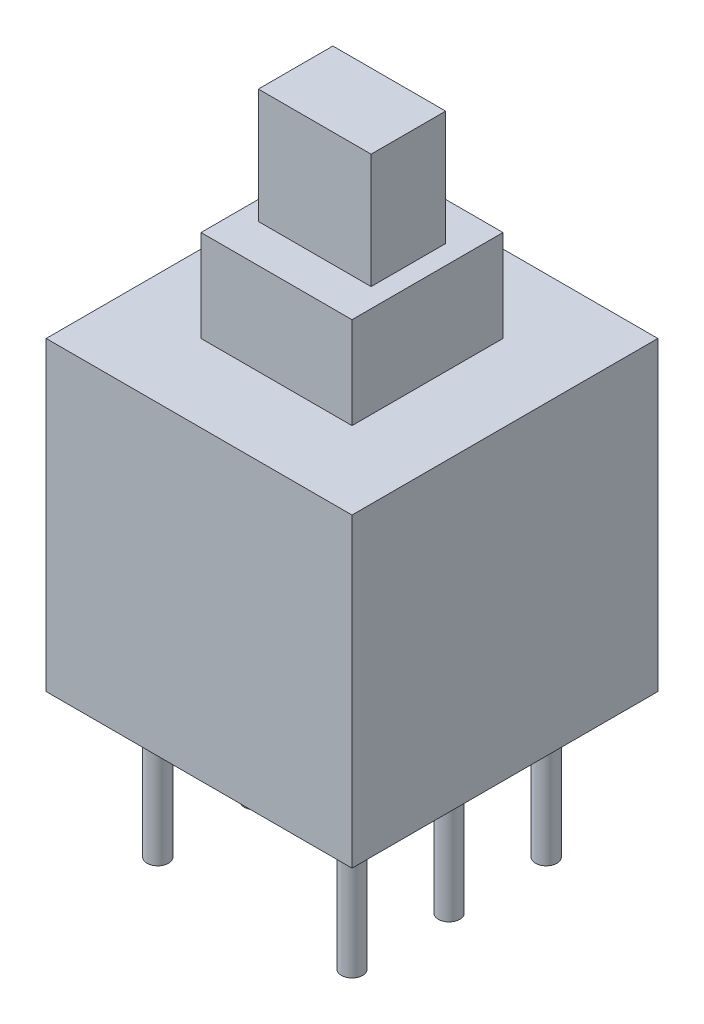
ISO-10303-21;
HEADER;
FILE_DESCRIPTION(('STEP AP214'),'2;1');
FILE_NAME('part.step','',(''),(''),'','','');
FILE_SCHEMA(('AUTOMOTIVE_DESIGN { 1 0 10303 214 1 1 1 1 }'));
ENDSEC;
DATA;
#1=APPLICATION_CONTEXT('core data for automotive mechanical design processes');
#2=APPLICATION_PROTOCOL_DEFINITION('international standard','automotive_design',2000,#1);
#3=PRODUCT_CONTEXT('',#1,'mechanical');
#4=PRODUCT('Part','Part','',(#3));
#5=PRODUCT_RELATED_PRODUCT_CATEGORY('part','',(#4));
#6=PRODUCT_DEFINITION_FORMATION('','',#4);
#7=PRODUCT_DEFINITION_CONTEXT('part definition',#1,'design');
#8=PRODUCT_DEFINITION('design','',#6,#7);
#9=PRODUCT_DEFINITION_SHAPE('','',#8);
#10=(LENGTH_UNIT() NAMED_UNIT(*) SI_UNIT(.MILLI.,.METRE.));
#11=(NAMED_UNIT(*) PLANE_ANGLE_UNIT() SI_UNIT($,.RADIAN.));
#12=(NAMED_UNIT(*) SI_UNIT($,.STERADIAN.) SOLID_ANGLE_UNIT());
#13=UNCERTAINTY_MEASURE_WITH_UNIT(LENGTH_MEASURE(1.E-05),#10,'distance_accuracy_value','');
#14=(GEOMETRIC_REPRESENTATION_CONTEXT(3) GLOBAL_UNCERTAINTY_ASSIGNED_CONTEXT((#13)) GLOBAL_UNIT_ASSIGNED_CONTEXT((#10,
#11,#12)) REPRESENTATION_CONTEXT('',''));
#15=CARTESIAN_POINT('',(0.,0.,0.));
#16=DIRECTION('',(0.,0.,1.));
#17=DIRECTION('',(1.,0.,0.));
#18=AXIS2_PLACEMENT_3D('',#15,#16,#17);
#19=CARTESIAN_POINT('',(-4.,8.,4.));
#20=DIRECTION('',(-1.,0.,0.));
#21=DIRECTION('',(0.,0.,1.));
#22=AXIS2_PLACEMENT_3D('',#19,#20,#21);
#23=PLANE('',#22);
#24=DIRECTION('',(0.,0.,-1.));
#25=VECTOR('',#24,1.);
#26=CARTESIAN_POINT('',(-4.,0.,4.));
#27=LINE('',#26,#25);
#28=CARTESIAN_POINT('',(-4.,0.,4.));
#29=VERTEX_POINT('',#28);
#30=CARTESIAN_POINT('',(-4.,0.,-4.));
#31=VERTEX_POINT('',#30);
#32=EDGE_CURVE('E187',#29,#31,#27,.T.);
#33=ORIENTED_EDGE('',*,*,#32,.F.);
#34=DIRECTION('',(0.,-1.,0.));
#35=VECTOR('',#34,1.);
#36=CARTESIAN_POINT('',(-4.,8.,4.));
#37=LINE('',#36,#35);
#38=CARTESIAN_POINT('',(-4.,8.,4.));
#39=VERTEX_POINT('',#38);
#40=EDGE_CURVE('E11',#39,#29,#37,.T.);
#41=ORIENTED_EDGE('',*,*,#40,.F.);
#42=DIRECTION('',(0.,0.,-1.));
#43=VECTOR('',#42,1.);
#44=CARTESIAN_POINT('',(-4.,8.,4.));
#45=LINE('',#44,#43);
#46=CARTESIAN_POINT('',(-4.,8.,-4.));
#47=VERTEX_POINT('',#46);
#48=EDGE_CURVE('E196',#39,#47,#45,.T.);
#49=ORIENTED_EDGE('',*,*,#48,.T.);
#50=DIRECTION('',(0.,-1.,0.));
#51=VECTOR('',#50,1.);
#52=CARTESIAN_POINT('',(-4.,8.,-4.));
#53=LINE('',#52,#51);
#54=EDGE_CURVE('E37',#47,#31,#53,.T.);
#55=ORIENTED_EDGE('',*,*,#54,.T.);
#56=EDGE_LOOP('',(#33,#41,#49,#55));
#57=FACE_BOUND('',#56,.T.);
#58=ADVANCED_FACE('F34',(#57),#23,.T.);
#59=CARTESIAN_POINT('',(-4.,8.,4.));
#60=DIRECTION('',(0.,0.,-1.));
#61=DIRECTION('',(-1.,0.,0.));
#62=AXIS2_PLACEMENT_3D('',#59,#60,#61);
#63=PLANE('',#62);
#64=DIRECTION('',(1.,0.,0.));
#65=VECTOR('',#64,1.);
#66=CARTESIAN_POINT('',(-4.,0.,4.));
#67=LINE('',#66,#65);
#68=CARTESIAN_POINT('',(4.,0.,4.));
#69=VERTEX_POINT('',#68);
#70=EDGE_CURVE('E200',#29,#69,#67,.T.);
#71=ORIENTED_EDGE('',*,*,#70,.T.);
#72=DIRECTION('',(0.,-1.,0.));
#73=VECTOR('',#72,1.);
#74=CARTESIAN_POINT('',(4.,8.,4.));
#75=LINE('',#74,#73);
#76=CARTESIAN_POINT('',(4.,8.,4.));
#77=VERTEX_POINT('',#76);
#78=EDGE_CURVE('E42',#77,#69,#75,.T.);
#79=ORIENTED_EDGE('',*,*,#78,.F.);
#80=DIRECTION('',(1.,0.,0.));
#81=VECTOR('',#80,1.);
#82=CARTESIAN_POINT('',(-4.,8.,4.));
#83=LINE('',#82,#81);
#84=EDGE_CURVE('E205',#39,#77,#83,.T.);
#85=ORIENTED_EDGE('',*,*,#84,.F.);
#86=ORIENTED_EDGE('',*,*,#40,.T.);
#87=EDGE_LOOP('',(#71,#79,#85,#86));
#88=FACE_BOUND('',#87,.T.);
#89=ADVANCED_FACE('F232',(#88),#63,.F.);
#90=CARTESIAN_POINT('',(4.,8.,4.));
#91=DIRECTION('',(-1.,0.,0.));
#92=DIRECTION('',(0.,0.,1.));
#93=AXIS2_PLACEMENT_3D('',#90,#91,#92);
#94=PLANE('',#93);
#95=DIRECTION('',(0.,0.,-1.));
#96=VECTOR('',#95,1.);
#97=CARTESIAN_POINT('',(4.,0.,4.));
#98=LINE('',#97,#96);
#99=CARTESIAN_POINT('',(4.,0.,-4.));
#100=VERTEX_POINT('',#99);
#101=EDGE_CURVE('E212',#69,#100,#98,.T.);
#102=ORIENTED_EDGE('',*,*,#101,.T.);
#103=DIRECTION('',(0.,-1.,0.));
#104=VECTOR('',#103,1.);
#105=CARTESIAN_POINT('',(4.,8.,-4.));
#106=LINE('',#105,#104);
#107=CARTESIAN_POINT('',(4.,8.,-4.));
#108=VERTEX_POINT('',#107);
#109=EDGE_CURVE('E217',#108,#100,#106,.T.);
#110=ORIENTED_EDGE('',*,*,#109,.F.);
#111=DIRECTION('',(0.,0.,-1.));
#112=VECTOR('',#111,1.);
#113=CARTESIAN_POINT('',(4.,8.,4.));
#114=LINE('',#113,#112);
#115=EDGE_CURVE('E203',#77,#108,#114,.T.);
#116=ORIENTED_EDGE('',*,*,#115,.F.);
#117=ORIENTED_EDGE('',*,*,#78,.T.);
#118=EDGE_LOOP('',(#102,#110,#116,#117));
#119=FACE_BOUND('',#118,.T.);
#120=ADVANCED_FACE('F236',(#119),#94,.F.);
#121=CARTESIAN_POINT('',(-4.,8.,-4.));
#122=DIRECTION('',(0.,0.,-1.));
#123=DIRECTION('',(-1.,0.,0.));
#124=AXIS2_PLACEMENT_3D('',#121,#122,#123);
#125=PLANE('',#124);
#126=DIRECTION('',(1.,0.,0.));
#127=VECTOR('',#126,1.);
#128=CARTESIAN_POINT('',(-4.,0.,-4.));
#129=LINE('',#128,#127);
#130=EDGE_CURVE('E209',#31,#100,#129,.T.);
#131=ORIENTED_EDGE('',*,*,#130,.F.);
#132=ORIENTED_EDGE('',*,*,#54,.F.);
#133=DIRECTION('',(1.,0.,0.));
#134=VECTOR('',#133,1.);
#135=CARTESIAN_POINT('',(-4.,8.,-4.));
#136=LINE('',#135,#134);
#137=EDGE_CURVE('E199',#47,#108,#136,.T.);
#138=ORIENTED_EDGE('',*,*,#137,.T.);
#139=ORIENTED_EDGE('',*,*,#109,.T.);
#140=EDGE_LOOP('',(#131,#132,#138,#139));
#141=FACE_BOUND('',#140,.T.);
#142=ADVANCED_FACE('F225',(#141),#125,.T.);
#143=CARTESIAN_POINT('',(0.,8.,0.));
#144=DIRECTION('',(0.,-1.,0.));
#145=DIRECTION('',(0.,0.,-1.));
#146=AXIS2_PLACEMENT_3D('',#143,#144,#145);
#147=PLANE('',#146);
#148=DIRECTION('',(1.,0.,0.));
#149=VECTOR('',#148,1.);
#150=CARTESIAN_POINT('',(-1.975,8.,1.975));
#151=LINE('',#150,#149);
#152=CARTESIAN_POINT('',(-1.975,8.,1.975));
#153=VERTEX_POINT('',#152);
#154=CARTESIAN_POINT('',(1.975,8.,1.975));
#155=VERTEX_POINT('',#154);
#156=EDGE_CURVE('E168',#153,#155,#151,.T.);
#157=ORIENTED_EDGE('',*,*,#156,.F.);
#158=DIRECTION('',(0.,0.,-1.));
#159=VECTOR('',#158,1.);
#160=CARTESIAN_POINT('',(-1.975,8.,1.975));
#161=LINE('',#160,#159);
#162=CARTESIAN_POINT('',(-1.975,8.,-1.975));
#163=VERTEX_POINT('',#162);
#164=EDGE_CURVE('E159',#153,#163,#161,.T.);
#165=ORIENTED_EDGE('',*,*,#164,.T.);
#166=DIRECTION('',(1.,0.,0.));
#167=VECTOR('',#166,1.);
#168=CARTESIAN_POINT('',(-1.975,8.,-1.975));
#169=LINE('',#168,#167);
#170=CARTESIAN_POINT('',(1.975,8.,-1.975));
#171=VERTEX_POINT('',#170);
#172=EDGE_CURVE('E177',#163,#171,#169,.T.);
#173=ORIENTED_EDGE('',*,*,#172,.T.);
#174=DIRECTION('',(0.,0.,-1.));
#175=VECTOR('',#174,1.);
#176=CARTESIAN_POINT('',(1.975,8.,1.975));
#177=LINE('',#176,#175);
#178=EDGE_CURVE('E179',#155,#171,#177,.T.);
#179=ORIENTED_EDGE('',*,*,#178,.F.);
#180=EDGE_LOOP('',(#157,#165,#173,#179));
#181=FACE_BOUND('',#180,.T.);
#182=ORIENTED_EDGE('',*,*,#48,.F.);
#183=ORIENTED_EDGE('',*,*,#84,.T.);
#184=ORIENTED_EDGE('',*,*,#115,.T.);
#185=ORIENTED_EDGE('',*,*,#137,.F.);
#186=EDGE_LOOP('',(#182,#183,#184,#185));
#187=FACE_BOUND('',#186,.T.);
#188=ADVANCED_FACE('F238',(#181,#187),#147,.F.);
#189=CARTESIAN_POINT('',(0.,0.,0.));
#190=DIRECTION('',(0.,-1.,0.));
#191=DIRECTION('',(0.,0.,-1.));
#192=AXIS2_PLACEMENT_3D('',#189,#190,#191);
#193=PLANE('',#192);
#194=CARTESIAN_POINT('',(-2.54,0.,2.54));
#195=DIRECTION('',(0.,-1.,0.));
#196=DIRECTION('',(0.,0.,-1.));
#197=AXIS2_PLACEMENT_3D('',#194,#195,#196);
#198=CIRCLE('',#197,0.28);
#199=CARTESIAN_POINT('',(-2.54,0.,2.26));
#200=VERTEX_POINT('',#199);
#201=EDGE_CURVE('E496',#200,#200,#198,.T.);
#202=ORIENTED_EDGE('',*,*,#201,.F.);
#203=EDGE_LOOP('',(#202));
#204=FACE_BOUND('',#203,.T.);
#205=CARTESIAN_POINT('',(-2.54,0.,0.));
#206=DIRECTION('',(0.,-1.,0.));
#207=DIRECTION('',(0.,0.,-1.));
#208=AXIS2_PLACEMENT_3D('',#205,#206,#207);
#209=CIRCLE('',#208,0.28);
#210=CARTESIAN_POINT('',(-2.54,0.,-0.28));
#211=VERTEX_POINT('',#210);
#212=EDGE_CURVE('E495',#211,#211,#209,.T.);
#213=ORIENTED_EDGE('',*,*,#212,.F.);
#214=EDGE_LOOP('',(#213));
#215=FACE_BOUND('',#214,.T.);
#216=CARTESIAN_POINT('',(-2.54,0.,-2.54));
#217=DIRECTION('',(0.,-1.,0.));
#218=DIRECTION('',(0.,0.,-1.));
#219=AXIS2_PLACEMENT_3D('',#216,#217,#218);
#220=CIRCLE('',#219,0.28);
#221=CARTESIAN_POINT('',(-2.54,0.,-2.82));
#222=VERTEX_POINT('',#221);
#223=EDGE_CURVE('E505',#222,#222,#220,.T.);
#224=ORIENTED_EDGE('',*,*,#223,.F.);
#225=EDGE_LOOP('',(#224));
#226=FACE_BOUND('',#225,.T.);
#227=CARTESIAN_POINT('',(2.54,0.,-2.54));
#228=DIRECTION('',(0.,-1.,0.));
#229=DIRECTION('',(0.,0.,-1.));
#230=AXIS2_PLACEMENT_3D('',#227,#228,#229);
#231=CIRCLE('',#230,0.28);
#232=CARTESIAN_POINT('',(2.54,0.,-2.82));
#233=VERTEX_POINT('',#232);
#234=EDGE_CURVE('E510',#233,#233,#231,.T.);
#235=ORIENTED_EDGE('',*,*,#234,.F.);
#236=EDGE_LOOP('',(#235));
#237=FACE_BOUND('',#236,.T.);
#238=CARTESIAN_POINT('',(2.54,0.,0.));
#239=DIRECTION('',(0.,-1.,0.));
#240=DIRECTION('',(0.,0.,-1.));
#241=AXIS2_PLACEMENT_3D('',#238,#239,#240);
#242=CIRCLE('',#241,0.28);
#243=CARTESIAN_POINT('',(2.54,0.,-0.28));
#244=VERTEX_POINT('',#243);
#245=EDGE_CURVE('E516',#244,#244,#242,.T.);
#246=ORIENTED_EDGE('',*,*,#245,.F.);
#247=EDGE_LOOP('',(#246));
#248=FACE_BOUND('',#247,.T.);
#249=CARTESIAN_POINT('',(2.54,0.,2.54));
#250=DIRECTION('',(0.,-1.,0.));
#251=DIRECTION('',(0.,0.,-1.));
#252=AXIS2_PLACEMENT_3D('',#249,#250,#251);
#253=CIRCLE('',#252,0.28);
#254=CARTESIAN_POINT('',(2.54,0.,2.26));
#255=VERTEX_POINT('',#254);
#256=EDGE_CURVE('E148',#255,#255,#253,.T.);
#257=ORIENTED_EDGE('',*,*,#256,.F.);
#258=EDGE_LOOP('',(#257));
#259=FACE_BOUND('',#258,.T.);
#260=ORIENTED_EDGE('',*,*,#32,.T.);
#261=ORIENTED_EDGE('',*,*,#130,.T.);
#262=ORIENTED_EDGE('',*,*,#101,.F.);
#263=ORIENTED_EDGE('',*,*,#70,.F.);
#264=EDGE_LOOP('',(#260,#261,#262,#263));
#265=FACE_BOUND('',#264,.T.);
#266=ADVANCED_FACE('F229',(#204,#215,#226,#237,#248,#259,#265),#193,.T.);
#267=CARTESIAN_POINT('',(-1.975,10.4,1.975));
#268=DIRECTION('',(-1.,0.,0.));
#269=DIRECTION('',(0.,0.,1.));
#270=AXIS2_PLACEMENT_3D('',#267,#268,#269);
#271=PLANE('',#270);
#272=ORIENTED_EDGE('',*,*,#164,.F.);
#273=DIRECTION('',(0.,-1.,0.));
#274=VECTOR('',#273,1.);
#275=CARTESIAN_POINT('',(-1.975,10.4,1.975));
#276=LINE('',#275,#274);
#277=CARTESIAN_POINT('',(-1.975,10.4,1.975));
#278=VERTEX_POINT('',#277);
#279=EDGE_CURVE('E184',#278,#153,#276,.T.);
#280=ORIENTED_EDGE('',*,*,#279,.F.);
#281=DIRECTION('',(0.,0.,-1.));
#282=VECTOR('',#281,1.);
#283=CARTESIAN_POINT('',(-1.975,10.4,1.975));
#284=LINE('',#283,#282);
#285=CARTESIAN_POINT('',(-1.975,10.4,-1.975));
#286=VERTEX_POINT('',#285);
#287=EDGE_CURVE('E164',#278,#286,#284,.T.);
#288=ORIENTED_EDGE('',*,*,#287,.T.);
#289=DIRECTION('',(0.,-1.,0.));
#290=VECTOR('',#289,1.);
#291=CARTESIAN_POINT('',(-1.975,10.4,-1.975));
#292=LINE('',#291,#290);
#293=EDGE_CURVE('E175',#286,#163,#292,.T.);
#294=ORIENTED_EDGE('',*,*,#293,.T.);
#295=EDGE_LOOP('',(#272,#280,#288,#294));
#296=FACE_BOUND('',#295,.T.);
#297=ADVANCED_FACE('F246',(#296),#271,.T.);
#298=CARTESIAN_POINT('',(-1.975,10.4,1.975));
#299=DIRECTION('',(0.,0.,-1.));
#300=DIRECTION('',(-1.,0.,0.));
#301=AXIS2_PLACEMENT_3D('',#298,#299,#300);
#302=PLANE('',#301);
#303=ORIENTED_EDGE('',*,*,#156,.T.);
#304=DIRECTION('',(0.,-1.,0.));
#305=VECTOR('',#304,1.);
#306=CARTESIAN_POINT('',(1.975,10.4,1.975));
#307=LINE('',#306,#305);
#308=CARTESIAN_POINT('',(1.975,10.4,1.975));
#309=VERTEX_POINT('',#308);
#310=EDGE_CURVE('E188',#309,#155,#307,.T.);
#311=ORIENTED_EDGE('',*,*,#310,.F.);
#312=DIRECTION('',(1.,0.,0.));
#313=VECTOR('',#312,1.);
#314=CARTESIAN_POINT('',(-1.975,10.4,1.975));
#315=LINE('',#314,#313);
#316=EDGE_CURVE('E173',#278,#309,#315,.T.);
#317=ORIENTED_EDGE('',*,*,#316,.F.);
#318=ORIENTED_EDGE('',*,*,#279,.T.);
#319=EDGE_LOOP('',(#303,#311,#317,#318));
#320=FACE_BOUND('',#319,.T.);
#321=ADVANCED_FACE('F281',(#320),#302,.F.);
#322=CARTESIAN_POINT('',(1.975,10.4,1.975));
#323=DIRECTION('',(-1.,0.,0.));
#324=DIRECTION('',(0.,0.,1.));
#325=AXIS2_PLACEMENT_3D('',#322,#323,#324);
#326=PLANE('',#325);
#327=ORIENTED_EDGE('',*,*,#178,.T.);
#328=DIRECTION('',(0.,-1.,0.));
#329=VECTOR('',#328,1.);
#330=CARTESIAN_POINT('',(1.975,10.4,-1.975));
#331=LINE('',#330,#329);
#332=CARTESIAN_POINT('',(1.975,10.4,-1.975));
#333=VERTEX_POINT('',#332);
#334=EDGE_CURVE('E191',#333,#171,#331,.T.);
#335=ORIENTED_EDGE('',*,*,#334,.F.);
#336=DIRECTION('',(0.,0.,-1.));
#337=VECTOR('',#336,1.);
#338=CARTESIAN_POINT('',(1.975,10.4,1.975));
#339=LINE('',#338,#337);
#340=EDGE_CURVE('E171',#309,#333,#339,.T.);
#341=ORIENTED_EDGE('',*,*,#340,.F.);
#342=ORIENTED_EDGE('',*,*,#310,.T.);
#343=EDGE_LOOP('',(#327,#335,#341,#342));
#344=FACE_BOUND('',#343,.T.);
#345=ADVANCED_FACE('F290',(#344),#326,.F.);
#346=CARTESIAN_POINT('',(-1.975,10.4,-1.975));
#347=DIRECTION('',(0.,0.,-1.));
#348=DIRECTION('',(-1.,0.,0.));
#349=AXIS2_PLACEMENT_3D('',#346,#347,#348);
#350=PLANE('',#349);
#351=ORIENTED_EDGE('',*,*,#172,.F.);
#352=ORIENTED_EDGE('',*,*,#293,.F.);
#353=DIRECTION('',(1.,0.,0.));
#354=VECTOR('',#353,1.);
#355=CARTESIAN_POINT('',(-1.975,10.4,-1.975));
#356=LINE('',#355,#354);
#357=EDGE_CURVE('E167',#286,#333,#356,.T.);
#358=ORIENTED_EDGE('',*,*,#357,.T.);
#359=ORIENTED_EDGE('',*,*,#334,.T.);
#360=EDGE_LOOP('',(#351,#352,#358,#359));
#361=FACE_BOUND('',#360,.T.);
#362=ADVANCED_FACE('F300',(#361),#350,.T.);
#363=CARTESIAN_POINT('',(0.,10.4,0.));
#364=DIRECTION('',(0.,-1.,0.));
#365=DIRECTION('',(0.,0.,-1.));
#366=AXIS2_PLACEMENT_3D('',#363,#364,#365);
#367=PLANE('',#366);
#368=DIRECTION('',(1.,0.,0.));
#369=VECTOR('',#368,1.);
#370=CARTESIAN_POINT('',(-1.475,10.4,0.975));
#371=LINE('',#370,#369);
#372=CARTESIAN_POINT('',(-1.475,10.4,0.975));
#373=VERTEX_POINT('',#372);
#374=CARTESIAN_POINT('',(1.475,10.4,0.975));
#375=VERTEX_POINT('',#374);
#376=EDGE_CURVE('E142',#373,#375,#371,.T.);
#377=ORIENTED_EDGE('',*,*,#376,.F.);
#378=DIRECTION('',(0.,0.,-1.));
#379=VECTOR('',#378,1.);
#380=CARTESIAN_POINT('',(-1.475,10.4,0.975));
#381=LINE('',#380,#379);
#382=CARTESIAN_POINT('',(-1.475,10.4,-0.975));
#383=VERTEX_POINT('',#382);
#384=EDGE_CURVE('E50',#373,#383,#381,.T.);
#385=ORIENTED_EDGE('',*,*,#384,.T.);
#386=DIRECTION('',(1.,0.,0.));
#387=VECTOR('',#386,1.);
#388=CARTESIAN_POINT('',(-1.475,10.4,-0.975));
#389=LINE('',#388,#387);
#390=CARTESIAN_POINT('',(1.475,10.4,-0.975));
#391=VERTEX_POINT('',#390);
#392=EDGE_CURVE('E55',#383,#391,#389,.T.);
#393=ORIENTED_EDGE('',*,*,#392,.T.);
#394=DIRECTION('',(0.,0.,-1.));
#395=VECTOR('',#394,1.);
#396=CARTESIAN_POINT('',(1.475,10.4,0.975));
#397=LINE('',#396,#395);
#398=EDGE_CURVE('E145',#375,#391,#397,.T.);
#399=ORIENTED_EDGE('',*,*,#398,.F.);
#400=EDGE_LOOP('',(#377,#385,#393,#399));
#401=FACE_BOUND('',#400,.T.);
#402=ORIENTED_EDGE('',*,*,#287,.F.);
#403=ORIENTED_EDGE('',*,*,#316,.T.);
#404=ORIENTED_EDGE('',*,*,#340,.T.);
#405=ORIENTED_EDGE('',*,*,#357,.F.);
#406=EDGE_LOOP('',(#402,#403,#404,#405));
#407=FACE_BOUND('',#406,.T.);
#408=ADVANCED_FACE('F310',(#401,#407),#367,.F.);
#409=CARTESIAN_POINT('',(-1.475,13.4,0.975));
#410=DIRECTION('',(-1.,0.,0.));
#411=DIRECTION('',(0.,0.,1.));
#412=AXIS2_PLACEMENT_3D('',#409,#410,#411);
#413=PLANE('',#412);
#414=ORIENTED_EDGE('',*,*,#384,.F.);
#415=DIRECTION('',(0.,-1.,0.));
#416=VECTOR('',#415,1.);
#417=CARTESIAN_POINT('',(-1.475,13.4,0.975));
#418=LINE('',#417,#416);
#419=CARTESIAN_POINT('',(-1.475,13.4,0.975));
#420=VERTEX_POINT('',#419);
#421=EDGE_CURVE('E140',#420,#373,#418,.T.);
#422=ORIENTED_EDGE('',*,*,#421,.F.);
#423=DIRECTION('',(0.,0.,-1.));
#424=VECTOR('',#423,1.);
#425=CARTESIAN_POINT('',(-1.475,13.4,0.975));
#426=LINE('',#425,#424);
#427=CARTESIAN_POINT('',(-1.475,13.4,-0.975));
#428=VERTEX_POINT('',#427);
#429=EDGE_CURVE('E133',#420,#428,#426,.T.);
#430=ORIENTED_EDGE('',*,*,#429,.T.);
#431=DIRECTION('',(0.,-1.,0.));
#432=VECTOR('',#431,1.);
#433=CARTESIAN_POINT('',(-1.475,13.4,-0.975));
#434=LINE('',#433,#432);
#435=EDGE_CURVE('E121',#428,#383,#434,.T.);
#436=ORIENTED_EDGE('',*,*,#435,.T.);
#437=EDGE_LOOP('',(#414,#422,#430,#436));
#438=FACE_BOUND('',#437,.T.);
#439=ADVANCED_FACE('F138',(#438),#413,.T.);
#440=CARTESIAN_POINT('',(-1.475,13.4,0.975));
#441=DIRECTION('',(0.,0.,-1.));
#442=DIRECTION('',(-1.,0.,0.));
#443=AXIS2_PLACEMENT_3D('',#440,#441,#442);
#444=PLANE('',#443);
#445=ORIENTED_EDGE('',*,*,#376,.T.);
#446=DIRECTION('',(0.,-1.,0.));
#447=VECTOR('',#446,1.);
#448=CARTESIAN_POINT('',(1.475,13.4,0.975));
#449=LINE('',#448,#447);
#450=CARTESIAN_POINT('',(1.475,13.4,0.975));
#451=VERTEX_POINT('',#450);
#452=EDGE_CURVE('E160',#451,#375,#449,.T.);
#453=ORIENTED_EDGE('',*,*,#452,.F.);
#454=DIRECTION('',(1.,0.,0.));
#455=VECTOR('',#454,1.);
#456=CARTESIAN_POINT('',(-1.475,13.4,0.975));
#457=LINE('',#456,#455);
#458=EDGE_CURVE('E128',#420,#451,#457,.T.);
#459=ORIENTED_EDGE('',*,*,#458,.F.);
#460=ORIENTED_EDGE('',*,*,#421,.T.);
#461=EDGE_LOOP('',(#445,#453,#459,#460));
#462=FACE_BOUND('',#461,.T.);
#463=ADVANCED_FACE('F328',(#462),#444,.F.);
#464=CARTESIAN_POINT('',(1.475,13.4,0.975));
#465=DIRECTION('',(-1.,0.,0.));
#466=DIRECTION('',(0.,0.,1.));
#467=AXIS2_PLACEMENT_3D('',#464,#465,#466);
#468=PLANE('',#467);
#469=ORIENTED_EDGE('',*,*,#398,.T.);
#470=DIRECTION('',(0.,-1.,0.));
#471=VECTOR('',#470,1.);
#472=CARTESIAN_POINT('',(1.475,13.4,-0.975));
#473=LINE('',#472,#471);
#474=CARTESIAN_POINT('',(1.475,13.4,-0.975));
#475=VERTEX_POINT('',#474);
#476=EDGE_CURVE('E127',#475,#391,#473,.T.);
#477=ORIENTED_EDGE('',*,*,#476,.F.);
#478=DIRECTION('',(0.,0.,-1.));
#479=VECTOR('',#478,1.);
#480=CARTESIAN_POINT('',(1.475,13.4,0.975));
#481=LINE('',#480,#479);
#482=EDGE_CURVE('E135',#451,#475,#481,.T.);
#483=ORIENTED_EDGE('',*,*,#482,.F.);
#484=ORIENTED_EDGE('',*,*,#452,.T.);
#485=EDGE_LOOP('',(#469,#477,#483,#484));
#486=FACE_BOUND('',#485,.T.);
#487=ADVANCED_FACE('F337',(#486),#468,.F.);
#488=CARTESIAN_POINT('',(-1.475,13.4,-0.975));
#489=DIRECTION('',(0.,0.,-1.));
#490=DIRECTION('',(-1.,0.,0.));
#491=AXIS2_PLACEMENT_3D('',#488,#489,#490);
#492=PLANE('',#491);
#493=ORIENTED_EDGE('',*,*,#392,.F.);
#494=ORIENTED_EDGE('',*,*,#435,.F.);
#495=DIRECTION('',(1.,0.,0.));
#496=VECTOR('',#495,1.);
#497=CARTESIAN_POINT('',(-1.475,13.4,-0.975));
#498=LINE('',#497,#496);
#499=EDGE_CURVE('E124',#428,#475,#498,.T.);
#500=ORIENTED_EDGE('',*,*,#499,.T.);
#501=ORIENTED_EDGE('',*,*,#476,.T.);
#502=EDGE_LOOP('',(#493,#494,#500,#501));
#503=FACE_BOUND('',#502,.T.);
#504=ADVANCED_FACE('F123',(#503),#492,.T.);
#505=CARTESIAN_POINT('',(0.,13.4,0.));
#506=DIRECTION('',(0.,-1.,0.));
#507=DIRECTION('',(0.,0.,-1.));
#508=AXIS2_PLACEMENT_3D('',#505,#506,#507);
#509=PLANE('',#508);
#510=ORIENTED_EDGE('',*,*,#429,.F.);
#511=ORIENTED_EDGE('',*,*,#458,.T.);
#512=ORIENTED_EDGE('',*,*,#482,.T.);
#513=ORIENTED_EDGE('',*,*,#499,.F.);
#514=EDGE_LOOP('',(#510,#511,#512,#513));
#515=FACE_BOUND('',#514,.T.);
#516=ADVANCED_FACE('F132',(#515),#509,.F.);
#517=CARTESIAN_POINT('',(2.54,-3.75,2.54));
#518=DIRECTION('',(0.,1.,0.));
#519=DIRECTION('',(0.,0.,1.));
#520=AXIS2_PLACEMENT_3D('',#517,#518,#519);
#521=CYLINDRICAL_SURFACE('',#520,0.28);
#522=CARTESIAN_POINT('',(2.54,-3.75,2.54));
#523=DIRECTION('',(0.,-1.,0.));
#524=DIRECTION('',(0.,0.,-1.));
#525=AXIS2_PLACEMENT_3D('',#522,#523,#524);
#526=CIRCLE('',#525,0.28);
#527=CARTESIAN_POINT('',(2.54,-3.75,2.26));
#528=VERTEX_POINT('',#527);
#529=EDGE_CURVE('E154',#528,#528,#526,.T.);
#530=ORIENTED_EDGE('',*,*,#529,.F.);
#531=EDGE_LOOP('',(#530));
#532=FACE_BOUND('',#531,.T.);
#533=ORIENTED_EDGE('',*,*,#256,.T.);
#534=EDGE_LOOP('',(#533));
#535=FACE_BOUND('',#534,.T.);
#536=ADVANCED_FACE('F364',(#532,#535),#521,.T.);
#537=CARTESIAN_POINT('',(2.54,-3.75,2.54));
#538=DIRECTION('',(0.,-1.,0.));
#539=DIRECTION('',(0.,0.,-1.));
#540=AXIS2_PLACEMENT_3D('',#537,#538,#539);
#541=PLANE('',#540);
#542=ORIENTED_EDGE('',*,*,#529,.T.);
#543=EDGE_LOOP('',(#542));
#544=FACE_BOUND('',#543,.T.);
#545=ADVANCED_FACE('F378',(#544),#541,.T.);
#546=CARTESIAN_POINT('',(2.54,-3.75,0.));
#547=DIRECTION('',(0.,1.,0.));
#548=DIRECTION('',(0.,0.,1.));
#549=AXIS2_PLACEMENT_3D('',#546,#547,#548);
#550=CYLINDRICAL_SURFACE('',#549,0.28);
#551=CARTESIAN_POINT('',(2.54,-3.75,0.));
#552=DIRECTION('',(0.,-1.,0.));
#553=DIRECTION('',(0.,0.,-1.));
#554=AXIS2_PLACEMENT_3D('',#551,#552,#553);
#555=CIRCLE('',#554,0.28);
#556=CARTESIAN_POINT('',(2.54,-3.75,-0.28));
#557=VERTEX_POINT('',#556);
#558=EDGE_CURVE('E519',#557,#557,#555,.T.);
#559=ORIENTED_EDGE('',*,*,#558,.F.);
#560=EDGE_LOOP('',(#559));
#561=FACE_BOUND('',#560,.T.);
#562=ORIENTED_EDGE('',*,*,#245,.T.);
#563=EDGE_LOOP('',(#562));
#564=FACE_BOUND('',#563,.T.);
#565=ADVANCED_FACE('F388',(#561,#564),#550,.T.);
#566=CARTESIAN_POINT('',(2.54,-3.75,0.));
#567=DIRECTION('',(0.,-1.,0.));
#568=DIRECTION('',(0.,0.,-1.));
#569=AXIS2_PLACEMENT_3D('',#566,#567,#568);
#570=PLANE('',#569);
#571=ORIENTED_EDGE('',*,*,#558,.T.);
#572=EDGE_LOOP('',(#571));
#573=FACE_BOUND('',#572,.T.);
#574=ADVANCED_FACE('F398',(#573),#570,.T.);
#575=CARTESIAN_POINT('',(2.54,-3.75,-2.54));
#576=DIRECTION('',(0.,1.,0.));
#577=DIRECTION('',(0.,0.,1.));
#578=AXIS2_PLACEMENT_3D('',#575,#576,#577);
#579=CYLINDRICAL_SURFACE('',#578,0.28);
#580=CARTESIAN_POINT('',(2.54,-3.75,-2.54));
#581=DIRECTION('',(0.,-1.,0.));
#582=DIRECTION('',(0.,0.,-1.));
#583=AXIS2_PLACEMENT_3D('',#580,#581,#582);
#584=CIRCLE('',#583,0.28);
#585=CARTESIAN_POINT('',(2.54,-3.75,-2.82));
#586=VERTEX_POINT('',#585);
#587=EDGE_CURVE('E513',#586,#586,#584,.T.);
#588=ORIENTED_EDGE('',*,*,#587,.F.);
#589=EDGE_LOOP('',(#588));
#590=FACE_BOUND('',#589,.T.);
#591=ORIENTED_EDGE('',*,*,#234,.T.);
#592=EDGE_LOOP('',(#591));
#593=FACE_BOUND('',#592,.T.);
#594=ADVANCED_FACE('F408',(#590,#593),#579,.T.);
#595=CARTESIAN_POINT('',(2.54,-3.75,-2.54));
#596=DIRECTION('',(0.,-1.,0.));
#597=DIRECTION('',(0.,0.,-1.));
#598=AXIS2_PLACEMENT_3D('',#595,#596,#597);
#599=PLANE('',#598);
#600=ORIENTED_EDGE('',*,*,#587,.T.);
#601=EDGE_LOOP('',(#600));
#602=FACE_BOUND('',#601,.T.);
#603=ADVANCED_FACE('F418',(#602),#599,.T.);
#604=CARTESIAN_POINT('',(-2.54,-3.75,-2.54));
#605=DIRECTION('',(0.,1.,0.));
#606=DIRECTION('',(0.,0.,1.));
#607=AXIS2_PLACEMENT_3D('',#604,#605,#606);
#608=CYLINDRICAL_SURFACE('',#607,0.28);
#609=CARTESIAN_POINT('',(-2.54,-3.75,-2.54));
#610=DIRECTION('',(0.,-1.,0.));
#611=DIRECTION('',(0.,0.,-1.));
#612=AXIS2_PLACEMENT_3D('',#609,#610,#611);
#613=CIRCLE('',#612,0.28);
#614=CARTESIAN_POINT('',(-2.54,-3.75,-2.82));
#615=VERTEX_POINT('',#614);
#616=EDGE_CURVE('E507',#615,#615,#613,.T.);
#617=ORIENTED_EDGE('',*,*,#616,.F.);
#618=EDGE_LOOP('',(#617));
#619=FACE_BOUND('',#618,.T.);
#620=ORIENTED_EDGE('',*,*,#223,.T.);
#621=EDGE_LOOP('',(#620));
#622=FACE_BOUND('',#621,.T.);
#623=ADVANCED_FACE('F428',(#619,#622),#608,.T.);
#624=CARTESIAN_POINT('',(-2.54,-3.75,-2.54));
#625=DIRECTION('',(0.,-1.,0.));
#626=DIRECTION('',(0.,0.,-1.));
#627=AXIS2_PLACEMENT_3D('',#624,#625,#626);
#628=PLANE('',#627);
#629=ORIENTED_EDGE('',*,*,#616,.T.);
#630=EDGE_LOOP('',(#629));
#631=FACE_BOUND('',#630,.T.);
#632=ADVANCED_FACE('F438',(#631),#628,.T.);
#633=CARTESIAN_POINT('',(-2.54,-3.75,0.));
#634=DIRECTION('',(0.,1.,0.));
#635=DIRECTION('',(0.,0.,1.));
#636=AXIS2_PLACEMENT_3D('',#633,#634,#635);
#637=CYLINDRICAL_SURFACE('',#636,0.28);
#638=CARTESIAN_POINT('',(-2.54,-3.75,0.));
#639=DIRECTION('',(0.,-1.,0.));
#640=DIRECTION('',(0.,0.,-1.));
#641=AXIS2_PLACEMENT_3D('',#638,#639,#640);
#642=CIRCLE('',#641,0.28);
#643=CARTESIAN_POINT('',(-2.54,-3.75,-0.28));
#644=VERTEX_POINT('',#643);
#645=EDGE_CURVE('E499',#644,#644,#642,.T.);
#646=ORIENTED_EDGE('',*,*,#645,.F.);
#647=EDGE_LOOP('',(#646));
#648=FACE_BOUND('',#647,.T.);
#649=ORIENTED_EDGE('',*,*,#212,.T.);
#650=EDGE_LOOP('',(#649));
#651=FACE_BOUND('',#650,.T.);
#652=ADVANCED_FACE('F448',(#648,#651),#637,.T.);
#653=CARTESIAN_POINT('',(-2.54,-3.75,0.));
#654=DIRECTION('',(0.,-1.,0.));
#655=DIRECTION('',(0.,0.,-1.));
#656=AXIS2_PLACEMENT_3D('',#653,#654,#655);
#657=PLANE('',#656);
#658=ORIENTED_EDGE('',*,*,#645,.T.);
#659=EDGE_LOOP('',(#658));
#660=FACE_BOUND('',#659,.T.);
#661=ADVANCED_FACE('F458',(#660),#657,.T.);
#662=CARTESIAN_POINT('',(-2.54,-3.75,2.54));
#663=DIRECTION('',(0.,1.,0.));
#664=DIRECTION('',(0.,0.,1.));
#665=AXIS2_PLACEMENT_3D('',#662,#663,#664);
#666=CYLINDRICAL_SURFACE('',#665,0.28);
#667=CARTESIAN_POINT('',(-2.54,-3.75,2.54));
#668=DIRECTION('',(0.,-1.,0.));
#669=DIRECTION('',(0.,0.,-1.));
#670=AXIS2_PLACEMENT_3D('',#667,#668,#669);
#671=CIRCLE('',#670,0.28);
#672=CARTESIAN_POINT('',(-2.54,-3.75,2.26));
#673=VERTEX_POINT('',#672);
#674=EDGE_CURVE('E494',#673,#673,#671,.T.);
#675=ORIENTED_EDGE('',*,*,#674,.F.);
#676=EDGE_LOOP('',(#675));
#677=FACE_BOUND('',#676,.T.);
#678=ORIENTED_EDGE('',*,*,#201,.T.);
#679=EDGE_LOOP('',(#678));
#680=FACE_BOUND('',#679,.T.);
#681=ADVANCED_FACE('F468',(#677,#680),#666,.T.);
#682=CARTESIAN_POINT('',(-2.54,-3.75,2.54));
#683=DIRECTION('',(0.,-1.,0.));
#684=DIRECTION('',(0.,0.,-1.));
#685=AXIS2_PLACEMENT_3D('',#682,#683,#684);
#686=PLANE('',#685);
#687=ORIENTED_EDGE('',*,*,#674,.T.);
#688=EDGE_LOOP('',(#687));
#689=FACE_BOUND('',#688,.T.);
#690=ADVANCED_FACE('F478',(#689),#686,.T.);
#691=CLOSED_SHELL('',(#58,#89,#120,#142,#188,#266,#297,#321,#345,#362,#408,#439,#463,#487,#504,
#516,#536,#545,#565,#574,#594,#603,#623,#632,#652,#661,#681,#690));
#692=MANIFOLD_SOLID_BREP('B2',#691);
#693=ADVANCED_BREP_SHAPE_REPRESENTATION('',(#18,#692),#14);
#694=SHAPE_DEFINITION_REPRESENTATION(#9,#693);
ENDSEC;
END-ISO-10303-21;
